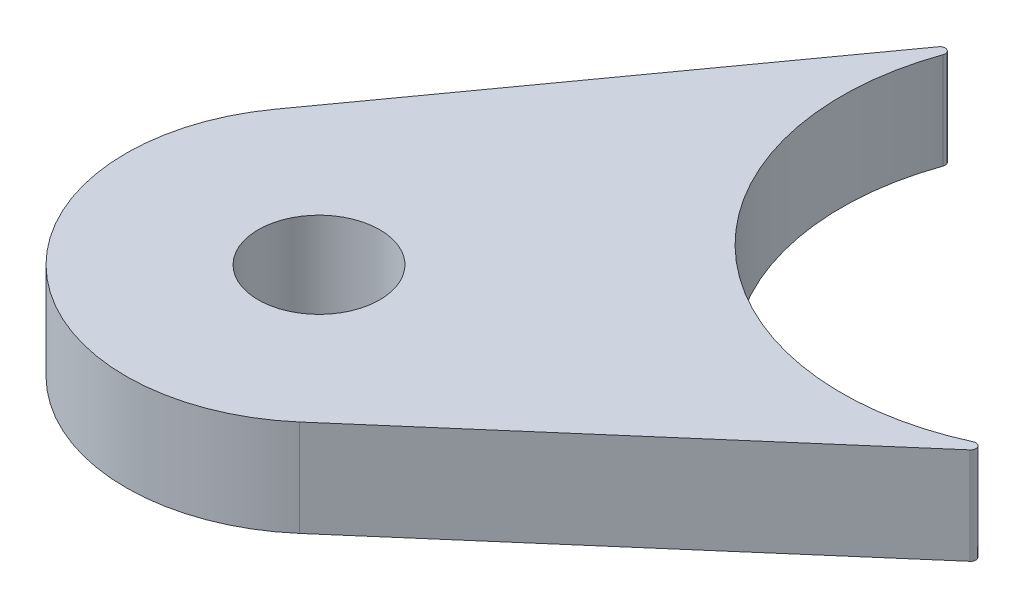
ISO-10303-21;
HEADER;
FILE_DESCRIPTION(('STEP AP214'),'2;1');
FILE_NAME('part.step','',(''),(''),'','','');
FILE_SCHEMA(('AUTOMOTIVE_DESIGN { 1 0 10303 214 1 1 1 1 }'));
ENDSEC;
DATA;
#1=APPLICATION_CONTEXT('core data for automotive mechanical design processes');
#2=APPLICATION_PROTOCOL_DEFINITION('international standard','automotive_design',2000,#1);
#3=PRODUCT_CONTEXT('',#1,'mechanical');
#4=PRODUCT('Part','Part','',(#3));
#5=PRODUCT_RELATED_PRODUCT_CATEGORY('part','',(#4));
#6=PRODUCT_DEFINITION_FORMATION('','',#4);
#7=PRODUCT_DEFINITION_CONTEXT('part definition',#1,'design');
#8=PRODUCT_DEFINITION('design','',#6,#7);
#9=PRODUCT_DEFINITION_SHAPE('','',#8);
#10=(LENGTH_UNIT() NAMED_UNIT(*) SI_UNIT(.MILLI.,.METRE.));
#11=(NAMED_UNIT(*) PLANE_ANGLE_UNIT() SI_UNIT($,.RADIAN.));
#12=(NAMED_UNIT(*) SI_UNIT($,.STERADIAN.) SOLID_ANGLE_UNIT());
#13=UNCERTAINTY_MEASURE_WITH_UNIT(LENGTH_MEASURE(1.E-05),#10,'distance_accuracy_value','');
#14=(GEOMETRIC_REPRESENTATION_CONTEXT(3) GLOBAL_UNCERTAINTY_ASSIGNED_CONTEXT((#13)) GLOBAL_UNIT_ASSIGNED_CONTEXT((#10,
#11,#12)) REPRESENTATION_CONTEXT('',''));
#15=CARTESIAN_POINT('',(0.,0.,0.));
#16=DIRECTION('',(0.,0.,1.));
#17=DIRECTION('',(1.,0.,0.));
#18=AXIS2_PLACEMENT_3D('',#15,#16,#17);
#19=CARTESIAN_POINT('',(-18.381123494241,4.7625,20.1087968474206));
#20=DIRECTION('',(0.,1.,0.));
#21=DIRECTION('',(0.,0.,1.));
#22=AXIS2_PLACEMENT_3D('',#19,#20,#21);
#23=PLANE('',#22);
#24=CARTESIAN_POINT('',(0.,4.7625,0.));
#25=DIRECTION('',(0.,-1.,0.));
#26=DIRECTION('',(0.,0.,1.));
#27=AXIS2_PLACEMENT_3D('',#24,#25,#26);
#28=CIRCLE('',#27,12.7);
#29=CARTESIAN_POINT('',(5.32275299763516,4.7625,11.5307545514665));
#30=VERTEX_POINT('',#29);
#31=CARTESIAN_POINT('',(-11.9612614039915,4.7625,-4.26828134327886));
#32=VERTEX_POINT('',#31);
#33=EDGE_CURVE('E93',#30,#32,#28,.T.);
#34=ORIENTED_EDGE('',*,*,#33,.T.);
#35=CARTESIAN_POINT('',(-12.2004866320714,4.7625,-4.35364697014444));
#36=DIRECTION('',(0.,1.,0.));
#37=DIRECTION('',(0.,0.,1.));
#38=AXIS2_PLACEMENT_3D('',#35,#36,#37);
#39=CIRCLE('',#38,0.254);
#40=CARTESIAN_POINT('',(-12.4066588654669,4.7625,-4.50200131007653));
#41=VERTEX_POINT('',#40);
#42=EDGE_CURVE('E41',#32,#41,#39,.T.);
#43=ORIENTED_EDGE('',*,*,#42,.T.);
#44=DIRECTION('',(-0.584072204457019,0.,0.811701706281758));
#45=VECTOR('',#44,1.);
#46=CARTESIAN_POINT('',(-26.1125822465749,4.7625,14.5455090999674));
#47=LINE('',#46,#45);
#48=CARTESIAN_POINT('',(-26.1125822465749,4.7625,14.5455090999674));
#49=VERTEX_POINT('',#48);
#50=EDGE_CURVE('E99',#41,#49,#47,.T.);
#51=ORIENTED_EDGE('',*,*,#50,.T.);
#52=CARTESIAN_POINT('',(-18.381123494241,4.7625,20.1087968474206));
#53=DIRECTION('',(0.,1.,0.));
#54=DIRECTION('',(0.,0.,1.));
#55=AXIS2_PLACEMENT_3D('',#52,#53,#54);
#56=CIRCLE('',#55,9.52500000000014);
#57=CARTESIAN_POINT('',(-12.1475295001981,4.7625,27.310736233269));
#58=VERTEX_POINT('',#57);
#59=EDGE_CURVE('E94',#49,#58,#56,.T.);
#60=ORIENTED_EDGE('',*,*,#59,.T.);
#61=DIRECTION('',(0.756109121873834,0.,-0.654445563679042));
#62=VECTOR('',#61,1.);
#63=CARTESIAN_POINT('',(-12.1475295001981,4.7625,27.310736233269));
#64=LINE('',#63,#62);
#65=CARTESIAN_POINT('',(5.59543723076235,4.7625,11.9534213594518));
#66=VERTEX_POINT('',#65);
#67=EDGE_CURVE('E85',#58,#66,#64,.T.);
#68=ORIENTED_EDGE('',*,*,#67,.T.);
#69=CARTESIAN_POINT('',(5.42920805758787,4.7625,11.7613696424958));
#70=DIRECTION('',(0.,1.,0.));
#71=DIRECTION('',(0.,0.,1.));
#72=AXIS2_PLACEMENT_3D('',#69,#70,#71);
#73=CIRCLE('',#72,0.254);
#74=EDGE_CURVE('E124',#66,#30,#73,.T.);
#75=ORIENTED_EDGE('',*,*,#74,.T.);
#76=EDGE_LOOP('',(#34,#43,#51,#60,#68,#75));
#77=FACE_BOUND('',#76,.T.);
#78=CARTESIAN_POINT('',(-18.381123494241,4.7625,20.1087968474206));
#79=DIRECTION('',(0.,1.,0.));
#80=DIRECTION('',(0.,0.,1.));
#81=AXIS2_PLACEMENT_3D('',#78,#79,#80);
#82=CIRCLE('',#81,3.);
#83=CARTESIAN_POINT('',(-18.381123494241,4.7625,17.1087968474206));
#84=VERTEX_POINT('',#83);
#85=EDGE_CURVE('E144',#84,#84,#82,.T.);
#86=ORIENTED_EDGE('',*,*,#85,.F.);
#87=EDGE_LOOP('',(#86));
#88=FACE_BOUND('',#87,.T.);
#89=ADVANCED_FACE('F33',(#77,#88),#23,.T.);
#90=CARTESIAN_POINT('',(-18.381123494241,0.,20.1087968474206));
#91=DIRECTION('',(0.,1.,0.));
#92=DIRECTION('',(0.,0.,1.));
#93=AXIS2_PLACEMENT_3D('',#90,#91,#92);
#94=PLANE('',#93);
#95=DIRECTION('',(-0.584072204457019,0.,0.811701706281758));
#96=VECTOR('',#95,1.);
#97=CARTESIAN_POINT('',(-26.1125822465749,0.,14.5455090999674));
#98=LINE('',#97,#96);
#99=CARTESIAN_POINT('',(-12.4066588654669,0.,-4.50200131007653));
#100=VERTEX_POINT('',#99);
#101=CARTESIAN_POINT('',(-26.1125822465749,0.,14.5455090999674));
#102=VERTEX_POINT('',#101);
#103=EDGE_CURVE('E103',#100,#102,#98,.T.);
#104=ORIENTED_EDGE('',*,*,#103,.F.);
#105=CARTESIAN_POINT('',(-12.2004866320714,0.,-4.35364697014444));
#106=DIRECTION('',(0.,1.,0.));
#107=DIRECTION('',(0.,0.,1.));
#108=AXIS2_PLACEMENT_3D('',#105,#106,#107);
#109=CIRCLE('',#108,0.254);
#110=CARTESIAN_POINT('',(-11.9612614039915,0.,-4.26828134327886));
#111=VERTEX_POINT('',#110);
#112=EDGE_CURVE('E118',#100,#111,#109,.F.);
#113=ORIENTED_EDGE('',*,*,#112,.T.);
#114=CARTESIAN_POINT('',(0.,0.,0.));
#115=DIRECTION('',(0.,-1.,0.));
#116=DIRECTION('',(0.,0.,1.));
#117=AXIS2_PLACEMENT_3D('',#114,#115,#116);
#118=CIRCLE('',#117,12.7);
#119=CARTESIAN_POINT('',(5.32275299763516,0.,11.5307545514665));
#120=VERTEX_POINT('',#119);
#121=EDGE_CURVE('E137',#120,#111,#118,.T.);
#122=ORIENTED_EDGE('',*,*,#121,.F.);
#123=CARTESIAN_POINT('',(5.42920805758787,0.,11.7613696424958));
#124=DIRECTION('',(0.,1.,0.));
#125=DIRECTION('',(0.,0.,1.));
#126=AXIS2_PLACEMENT_3D('',#123,#124,#125);
#127=CIRCLE('',#126,0.254);
#128=CARTESIAN_POINT('',(5.59543723076235,0.,11.9534213594518));
#129=VERTEX_POINT('',#128);
#130=EDGE_CURVE('E112',#120,#129,#127,.F.);
#131=ORIENTED_EDGE('',*,*,#130,.T.);
#132=DIRECTION('',(0.756109121873834,0.,-0.654445563679042));
#133=VECTOR('',#132,1.);
#134=CARTESIAN_POINT('',(-12.1475295001981,0.,27.310736233269));
#135=LINE('',#134,#133);
#136=CARTESIAN_POINT('',(-12.1475295001981,0.,27.310736233269));
#137=VERTEX_POINT('',#136);
#138=EDGE_CURVE('E140',#137,#129,#135,.T.);
#139=ORIENTED_EDGE('',*,*,#138,.F.);
#140=CARTESIAN_POINT('',(-18.381123494241,0.,20.1087968474206));
#141=DIRECTION('',(0.,1.,0.));
#142=DIRECTION('',(0.,0.,1.));
#143=AXIS2_PLACEMENT_3D('',#140,#141,#142);
#144=CIRCLE('',#143,9.52500000000014);
#145=EDGE_CURVE('E107',#102,#137,#144,.T.);
#146=ORIENTED_EDGE('',*,*,#145,.F.);
#147=EDGE_LOOP('',(#104,#113,#122,#131,#139,#146));
#148=FACE_BOUND('',#147,.T.);
#149=CARTESIAN_POINT('',(-18.381123494241,0.,20.1087968474206));
#150=DIRECTION('',(0.,1.,0.));
#151=DIRECTION('',(0.,0.,1.));
#152=AXIS2_PLACEMENT_3D('',#149,#150,#151);
#153=CIRCLE('',#152,3.);
#154=CARTESIAN_POINT('',(-18.381123494241,0.,17.1087968474206));
#155=VERTEX_POINT('',#154);
#156=EDGE_CURVE('E147',#155,#155,#153,.T.);
#157=ORIENTED_EDGE('',*,*,#156,.T.);
#158=EDGE_LOOP('',(#157));
#159=FACE_BOUND('',#158,.T.);
#160=ADVANCED_FACE('F135',(#148,#159),#94,.F.);
#161=CARTESIAN_POINT('',(-18.381123494241,4.7625,20.1087968474206));
#162=DIRECTION('',(0.,-1.,0.));
#163=DIRECTION('',(0.,0.,-1.));
#164=AXIS2_PLACEMENT_3D('',#161,#162,#163);
#165=CYLINDRICAL_SURFACE('',#164,9.52500000000014);
#166=ORIENTED_EDGE('',*,*,#145,.T.);
#167=DIRECTION('',(0.,-1.,0.));
#168=VECTOR('',#167,1.);
#169=CARTESIAN_POINT('',(-12.1475295001981,4.7625,27.310736233269));
#170=LINE('',#169,#168);
#171=EDGE_CURVE('E89',#58,#137,#170,.T.);
#172=ORIENTED_EDGE('',*,*,#171,.F.);
#173=ORIENTED_EDGE('',*,*,#59,.F.);
#174=DIRECTION('',(0.,-1.,0.));
#175=VECTOR('',#174,1.);
#176=CARTESIAN_POINT('',(-26.1125822465749,4.7625,14.5455090999674));
#177=LINE('',#176,#175);
#178=EDGE_CURVE('E109',#49,#102,#177,.T.);
#179=ORIENTED_EDGE('',*,*,#178,.T.);
#180=EDGE_LOOP('',(#166,#172,#173,#179));
#181=FACE_BOUND('',#180,.T.);
#182=ADVANCED_FACE('F105',(#181),#165,.T.);
#183=CARTESIAN_POINT('',(-12.1475295001981,4.7625,27.310736233269));
#184=DIRECTION('',(-0.654445563679042,0.,-0.756109121873834));
#185=DIRECTION('',(-0.756109121873834,0.,0.654445563679042));
#186=AXIS2_PLACEMENT_3D('',#183,#184,#185);
#187=PLANE('',#186);
#188=ORIENTED_EDGE('',*,*,#138,.T.);
#189=DIRECTION('',(0.,-1.,0.));
#190=VECTOR('',#189,1.);
#191=CARTESIAN_POINT('',(5.59543723076235,4.7625,11.9534213594518));
#192=LINE('',#191,#190);
#193=EDGE_CURVE('E11',#129,#66,#192,.F.);
#194=ORIENTED_EDGE('',*,*,#193,.T.);
#195=ORIENTED_EDGE('',*,*,#67,.F.);
#196=ORIENTED_EDGE('',*,*,#171,.T.);
#197=EDGE_LOOP('',(#188,#194,#195,#196));
#198=FACE_BOUND('',#197,.T.);
#199=ADVANCED_FACE('F87',(#198),#187,.F.);
#200=CARTESIAN_POINT('',(0.,4.7625,0.));
#201=DIRECTION('',(0.,-1.,0.));
#202=DIRECTION('',(0.,0.,-1.));
#203=AXIS2_PLACEMENT_3D('',#200,#201,#202);
#204=CYLINDRICAL_SURFACE('',#203,12.7);
#205=ORIENTED_EDGE('',*,*,#121,.T.);
#206=DIRECTION('',(0.,-1.,0.));
#207=VECTOR('',#206,1.);
#208=CARTESIAN_POINT('',(-11.9612614039915,4.7625,-4.26828134327886));
#209=LINE('',#208,#207);
#210=EDGE_CURVE('E54',#111,#32,#209,.F.);
#211=ORIENTED_EDGE('',*,*,#210,.T.);
#212=ORIENTED_EDGE('',*,*,#33,.F.);
#213=DIRECTION('',(0.,-1.,0.));
#214=VECTOR('',#213,1.);
#215=CARTESIAN_POINT('',(5.32275299763516,4.7625,11.5307545514665));
#216=LINE('',#215,#214);
#217=EDGE_CURVE('E120',#30,#120,#216,.T.);
#218=ORIENTED_EDGE('',*,*,#217,.T.);
#219=EDGE_LOOP('',(#205,#211,#212,#218));
#220=FACE_BOUND('',#219,.T.);
#221=ADVANCED_FACE('F138',(#220),#204,.F.);
#222=CARTESIAN_POINT('',(-26.1125822465749,4.7625,14.5455090999674));
#223=DIRECTION('',(0.811701706281758,0.,0.584072204457019));
#224=DIRECTION('',(0.584072204457019,0.,-0.811701706281759));
#225=AXIS2_PLACEMENT_3D('',#222,#223,#224);
#226=PLANE('',#225);
#227=ORIENTED_EDGE('',*,*,#50,.F.);
#228=DIRECTION('',(0.,-1.,0.));
#229=VECTOR('',#228,1.);
#230=CARTESIAN_POINT('',(-12.4066588654669,4.7625,-4.50200131007653));
#231=LINE('',#230,#229);
#232=EDGE_CURVE('E108',#41,#100,#231,.T.);
#233=ORIENTED_EDGE('',*,*,#232,.T.);
#234=ORIENTED_EDGE('',*,*,#103,.T.);
#235=ORIENTED_EDGE('',*,*,#178,.F.);
#236=EDGE_LOOP('',(#227,#233,#234,#235));
#237=FACE_BOUND('',#236,.T.);
#238=ADVANCED_FACE('F129',(#237),#226,.F.);
#239=CARTESIAN_POINT('',(-18.381123494241,4.7625,20.1087968474206));
#240=DIRECTION('',(0.,-1.,0.));
#241=DIRECTION('',(0.,0.,-1.));
#242=AXIS2_PLACEMENT_3D('',#239,#240,#241);
#243=CYLINDRICAL_SURFACE('',#242,3.);
#244=CARTESIAN_POINT('',(-18.381123494241,4.7625,17.1087968474206));
#245=CARTESIAN_POINT('',(-18.381123494241,4.712890625,17.1087968474206));
#246=CARTESIAN_POINT('',(-18.381123494241,4.66328125,17.1087968474206));
#247=CARTESIAN_POINT('',(-18.381123494241,4.5640625,17.1087968474206));
#248=CARTESIAN_POINT('',(-18.381123494241,4.514453125,17.1087968474206));
#249=CARTESIAN_POINT('',(-18.381123494241,4.415234375,17.1087968474206));
#250=CARTESIAN_POINT('',(-18.381123494241,4.365625,17.1087968474206));
#251=CARTESIAN_POINT('',(-18.381123494241,4.26640625,17.1087968474206));
#252=CARTESIAN_POINT('',(-18.381123494241,4.216796875,17.1087968474206));
#253=CARTESIAN_POINT('',(-18.381123494241,4.117578125,17.1087968474206));
#254=CARTESIAN_POINT('',(-18.381123494241,4.06796875,17.1087968474206));
#255=CARTESIAN_POINT('',(-18.381123494241,3.96875,17.1087968474206));
#256=CARTESIAN_POINT('',(-18.381123494241,3.919140625,17.1087968474206));
#257=CARTESIAN_POINT('',(-18.381123494241,3.819921875,17.1087968474206));
#258=CARTESIAN_POINT('',(-18.381123494241,3.7703125,17.1087968474206));
#259=CARTESIAN_POINT('',(-18.381123494241,3.67109375,17.1087968474206));
#260=CARTESIAN_POINT('',(-18.381123494241,3.621484375,17.1087968474206));
#261=CARTESIAN_POINT('',(-18.381123494241,3.522265625,17.1087968474206));
#262=CARTESIAN_POINT('',(-18.381123494241,3.47265625,17.1087968474206));
#263=CARTESIAN_POINT('',(-18.381123494241,3.3734375,17.1087968474206));
#264=CARTESIAN_POINT('',(-18.381123494241,3.323828125,17.1087968474206));
#265=CARTESIAN_POINT('',(-18.381123494241,3.224609375,17.1087968474206));
#266=CARTESIAN_POINT('',(-18.381123494241,3.175,17.1087968474206));
#267=CARTESIAN_POINT('',(-18.381123494241,3.07578125,17.1087968474206));
#268=CARTESIAN_POINT('',(-18.381123494241,3.026171875,17.1087968474206));
#269=CARTESIAN_POINT('',(-18.381123494241,2.926953125,17.1087968474206));
#270=CARTESIAN_POINT('',(-18.381123494241,2.87734375,17.1087968474206));
#271=CARTESIAN_POINT('',(-18.381123494241,2.778125,17.1087968474206));
#272=CARTESIAN_POINT('',(-18.381123494241,2.728515625,17.1087968474206));
#273=CARTESIAN_POINT('',(-18.381123494241,2.629296875,17.1087968474206));
#274=CARTESIAN_POINT('',(-18.381123494241,2.5796875,17.1087968474206));
#275=CARTESIAN_POINT('',(-18.381123494241,2.48046875,17.1087968474206));
#276=CARTESIAN_POINT('',(-18.381123494241,2.430859375,17.1087968474206));
#277=CARTESIAN_POINT('',(-18.381123494241,2.331640625,17.1087968474206));
#278=CARTESIAN_POINT('',(-18.381123494241,2.28203125,17.1087968474206));
#279=CARTESIAN_POINT('',(-18.381123494241,2.1828125,17.1087968474206));
#280=CARTESIAN_POINT('',(-18.381123494241,2.133203125,17.1087968474206));
#281=CARTESIAN_POINT('',(-18.381123494241,2.033984375,17.1087968474206));
#282=CARTESIAN_POINT('',(-18.381123494241,1.984375,17.1087968474206));
#283=CARTESIAN_POINT('',(-18.381123494241,1.88515625,17.1087968474206));
#284=CARTESIAN_POINT('',(-18.381123494241,1.835546875,17.1087968474206));
#285=CARTESIAN_POINT('',(-18.381123494241,1.736328125,17.1087968474206));
#286=CARTESIAN_POINT('',(-18.381123494241,1.68671875,17.1087968474206));
#287=CARTESIAN_POINT('',(-18.381123494241,1.5875,17.1087968474206));
#288=CARTESIAN_POINT('',(-18.381123494241,1.537890625,17.1087968474206));
#289=CARTESIAN_POINT('',(-18.381123494241,1.438671875,17.1087968474206));
#290=CARTESIAN_POINT('',(-18.381123494241,1.3890625,17.1087968474206));
#291=CARTESIAN_POINT('',(-18.381123494241,1.28984375,17.1087968474206));
#292=CARTESIAN_POINT('',(-18.381123494241,1.240234375,17.1087968474206));
#293=CARTESIAN_POINT('',(-18.381123494241,1.141015625,17.1087968474206));
#294=CARTESIAN_POINT('',(-18.381123494241,1.09140625,17.1087968474206));
#295=CARTESIAN_POINT('',(-18.381123494241,0.992187499999999,17.1087968474206));
#296=CARTESIAN_POINT('',(-18.381123494241,0.942578124999999,17.1087968474206));
#297=CARTESIAN_POINT('',(-18.381123494241,0.843359375,17.1087968474206));
#298=CARTESIAN_POINT('',(-18.381123494241,0.79375,17.1087968474206));
#299=CARTESIAN_POINT('',(-18.381123494241,0.69453125,17.1087968474206));
#300=CARTESIAN_POINT('',(-18.381123494241,0.644921875,17.1087968474206));
#301=CARTESIAN_POINT('',(-18.381123494241,0.545703125,17.1087968474206));
#302=CARTESIAN_POINT('',(-18.381123494241,0.49609375,17.1087968474206));
#303=CARTESIAN_POINT('',(-18.381123494241,0.396875,17.1087968474206));
#304=CARTESIAN_POINT('',(-18.381123494241,0.347265625,17.1087968474206));
#305=CARTESIAN_POINT('',(-18.381123494241,0.248046875,17.1087968474206));
#306=CARTESIAN_POINT('',(-18.381123494241,0.1984375,17.1087968474206));
#307=CARTESIAN_POINT('',(-18.381123494241,0.09921875,17.1087968474206));
#308=CARTESIAN_POINT('',(-18.381123494241,0.049609375,17.1087968474206));
#309=CARTESIAN_POINT('',(-18.381123494241,0.,17.1087968474206));
#310=B_SPLINE_CURVE_WITH_KNOTS('',3,(#244,#245,#246,#247,#248,#249,#250,#251,#252,#253,#254,
#255,#256,#257,#258,#259,#260,#261,#262,#263,#264,#265,#266,#267,#268,#269,#270,#271,#272,#273,
#274,#275,#276,#277,#278,#279,#280,#281,#282,#283,#284,#285,#286,#287,#288,#289,#290,#291,#292,
#293,#294,#295,#296,#297,#298,#299,#300,#301,#302,#303,#304,#305,#306,#307,#308,#309),
.UNSPECIFIED.,.F.,.F.,(4,2,2,2,2,2,2,2,2,2,2,2,2,2,2,2,2,2,2,2,2,2,2,2,2,2,2,2,2,2,2,2,4),(0.,
0.148828125,0.29765625,0.446484375,0.5953125,0.744140625,0.892968750000001,1.041796875,1.190625,
1.339453125,1.48828125,1.637109375,1.7859375,1.934765625,2.08359375,2.232421875,2.38125,
2.530078125,2.67890625,2.827734375,2.9765625,3.125390625,3.27421875,3.423046875,3.571875,
3.720703125,3.86953125,4.018359375,4.1671875,4.316015625,4.46484375,4.613671875,4.7625),.UNSPECIFIED.);
#311=EDGE_CURVE('BSEAM153',#84,#155,#310,.T.);
#312=ORIENTED_EDGE('',*,*,#85,.T.);
#313=ORIENTED_EDGE('',*,*,#156,.F.);
#314=ORIENTED_EDGE('',*,*,#311,.T.);
#315=ORIENTED_EDGE('',*,*,#311,.F.);
#316=EDGE_LOOP('',(#312,#314,#313,#315));
#317=FACE_BOUND('',#316,.T.);
#318=ADVANCED_FACE('F153',(#317),#243,.F.);
#319=CARTESIAN_POINT('',(-12.2004866320714,4.7625,-4.35364697014444));
#320=DIRECTION('',(0.,-1.,0.));
#321=DIRECTION('',(0.,0.,-1.));
#322=AXIS2_PLACEMENT_3D('',#319,#320,#321);
#323=CYLINDRICAL_SURFACE('',#322,0.254);
#324=ORIENTED_EDGE('',*,*,#42,.F.);
#325=ORIENTED_EDGE('',*,*,#210,.F.);
#326=ORIENTED_EDGE('',*,*,#112,.F.);
#327=ORIENTED_EDGE('',*,*,#232,.F.);
#328=EDGE_LOOP('',(#324,#325,#326,#327));
#329=FACE_BOUND('',#328,.T.);
#330=ADVANCED_FACE('F132',(#329),#323,.T.);
#331=CARTESIAN_POINT('',(5.42920805758787,4.7625,11.7613696424958));
#332=DIRECTION('',(0.,-1.,0.));
#333=DIRECTION('',(0.,0.,-1.));
#334=AXIS2_PLACEMENT_3D('',#331,#332,#333);
#335=CYLINDRICAL_SURFACE('',#334,0.254);
#336=ORIENTED_EDGE('',*,*,#74,.F.);
#337=ORIENTED_EDGE('',*,*,#193,.F.);
#338=ORIENTED_EDGE('',*,*,#130,.F.);
#339=ORIENTED_EDGE('',*,*,#217,.F.);
#340=EDGE_LOOP('',(#336,#337,#338,#339));
#341=FACE_BOUND('',#340,.T.);
#342=ADVANCED_FACE('F35',(#341),#335,.T.);
#343=CLOSED_SHELL('',(#89,#160,#182,#199,#221,#238,#318,#330,#342));
#344=MANIFOLD_SOLID_BREP('B2',#343);
#345=ADVANCED_BREP_SHAPE_REPRESENTATION('',(#18,#344),#14);
#346=SHAPE_DEFINITION_REPRESENTATION(#9,#345);
ENDSEC;
END-ISO-10303-21;
